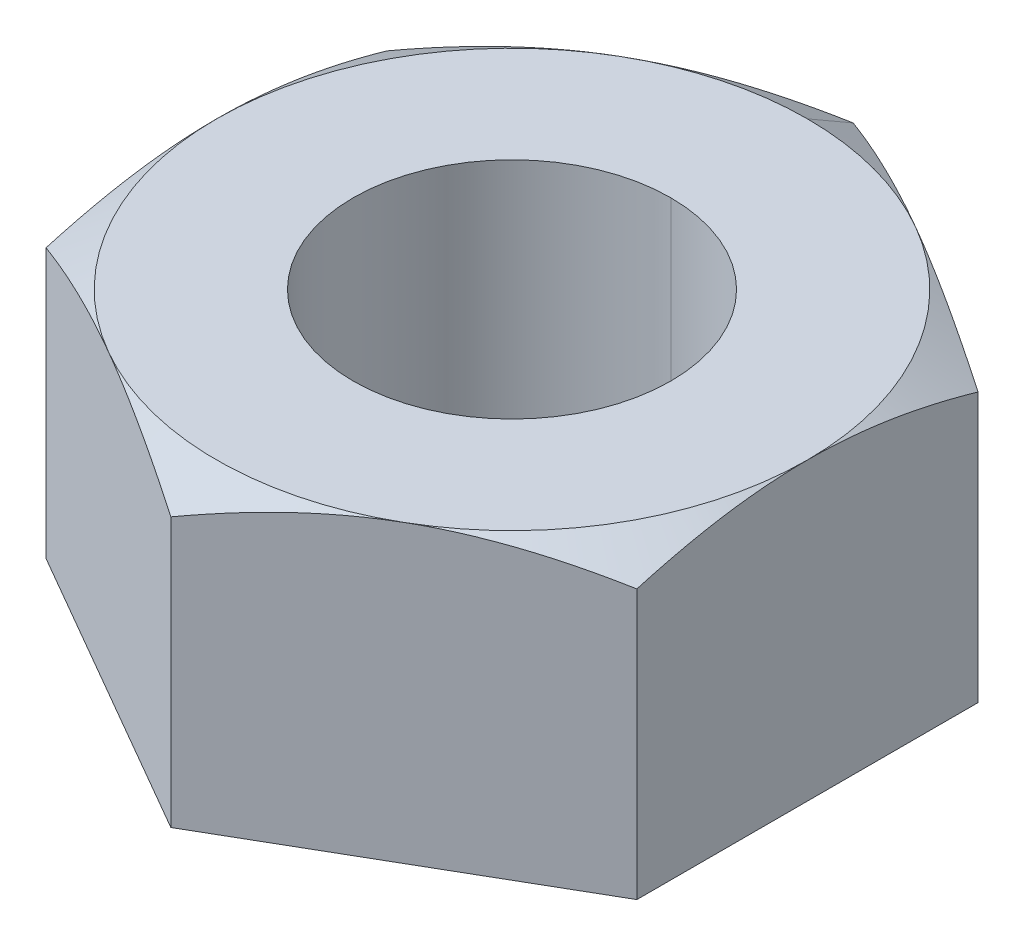
ISO-10303-21;
HEADER;
FILE_DESCRIPTION(('STEP AP214'),'2;1');
FILE_NAME('part.step','',(''),(''),'','','');
FILE_SCHEMA(('AUTOMOTIVE_DESIGN { 1 0 10303 214 1 1 1 1 }'));
ENDSEC;
DATA;
#1=APPLICATION_CONTEXT('core data for automotive mechanical design processes');
#2=APPLICATION_PROTOCOL_DEFINITION('international standard','automotive_design',2000,#1);
#3=PRODUCT_CONTEXT('',#1,'mechanical');
#4=PRODUCT('Part','Part','',(#3));
#5=PRODUCT_RELATED_PRODUCT_CATEGORY('part','',(#4));
#6=PRODUCT_DEFINITION_FORMATION('','',#4);
#7=PRODUCT_DEFINITION_CONTEXT('part definition',#1,'design');
#8=PRODUCT_DEFINITION('design','',#6,#7);
#9=PRODUCT_DEFINITION_SHAPE('','',#8);
#10=(LENGTH_UNIT() NAMED_UNIT(*) SI_UNIT(.MILLI.,.METRE.));
#11=(NAMED_UNIT(*) PLANE_ANGLE_UNIT() SI_UNIT($,.RADIAN.));
#12=(NAMED_UNIT(*) SI_UNIT($,.STERADIAN.) SOLID_ANGLE_UNIT());
#13=UNCERTAINTY_MEASURE_WITH_UNIT(LENGTH_MEASURE(1.E-05),#10,'distance_accuracy_value','');
#14=(GEOMETRIC_REPRESENTATION_CONTEXT(3) GLOBAL_UNCERTAINTY_ASSIGNED_CONTEXT((#13)) GLOBAL_UNIT_ASSIGNED_CONTEXT((#10,
#11,#12)) REPRESENTATION_CONTEXT('',''));
#15=CARTESIAN_POINT('',(0.,0.,0.));
#16=DIRECTION('',(0.,0.,1.));
#17=DIRECTION('',(1.,0.,0.));
#18=AXIS2_PLACEMENT_3D('',#15,#16,#17);
#19=CARTESIAN_POINT('',(0.,4.,0.));
#20=DIRECTION('',(0.,-1.,0.));
#21=DIRECTION('',(0.,0.,-1.));
#22=AXIS2_PLACEMENT_3D('',#19,#20,#21);
#23=CONICAL_SURFACE('',#22,4.,1.0471975511966);
#24=CARTESIAN_POINT('',(-2.,4.,3.46410161513776));
#25=CARTESIAN_POINT('',(-2.49519443537965,4.,3.17820097457012));
#26=CARTESIAN_POINT('',(-3.01152933126461,3.90355711876249,2.88009488343893));
#27=CARTESIAN_POINT('',(-3.48009044106827,3.81603759640316,2.609571000562));
#28=CARTESIAN_POINT('',(-3.99999999999999,3.64273441009185,2.30940107675852));
#29=B_SPLINE_CURVE_WITH_KNOTS('',2,(#24,#25,#26,#27,#28),.UNSPECIFIED.,.F.,.F.,(3,2,3),(0.,0.5,
1.),.UNSPECIFIED.);
#30=CARTESIAN_POINT('',(-2.,4.,3.46410161513776));
#31=VERTEX_POINT('',#30);
#32=CARTESIAN_POINT('',(-4.,3.64273441009184,2.30940107675852));
#33=VERTEX_POINT('',#32);
#34=EDGE_CURVE('E437',#31,#33,#29,.T.);
#35=ORIENTED_EDGE('',*,*,#34,.F.);
#36=CARTESIAN_POINT('',(0.,4.,0.));
#37=DIRECTION('',(0.,-1.,0.));
#38=DIRECTION('',(0.,0.,1.));
#39=AXIS2_PLACEMENT_3D('',#36,#37,#38);
#40=CIRCLE('',#39,4.);
#41=CARTESIAN_POINT('',(-4.,4.,0.));
#42=VERTEX_POINT('',#41);
#43=EDGE_CURVE('E400',#31,#42,#40,.T.);
#44=ORIENTED_EDGE('',*,*,#43,.T.);
#45=CARTESIAN_POINT('',(-4.,3.64273441009185,2.30940107675853));
#46=CARTESIAN_POINT('',(-4.,3.81524432413674,1.7118092048883));
#47=CARTESIAN_POINT('',(-4.,3.90291557833834,1.17197157061067));
#48=CARTESIAN_POINT('',(-4.,4.,0.574172155142945));
#49=CARTESIAN_POINT('',(-4.,4.,0.));
#50=B_SPLINE_CURVE_WITH_KNOTS('',2,(#45,#46,#47,#48,#49),.UNSPECIFIED.,.F.,.F.,(3,2,3),(0.,0.5,
1.),.UNSPECIFIED.);
#51=EDGE_CURVE('E344',#33,#42,#50,.T.);
#52=ORIENTED_EDGE('',*,*,#51,.F.);
#53=EDGE_LOOP('',(#35,#44,#52));
#54=FACE_BOUND('',#53,.T.);
#55=ADVANCED_FACE('F16',(#54),#23,.T.);
#56=CARTESIAN_POINT('',(0.,4.,0.));
#57=DIRECTION('',(0.,-1.,0.));
#58=DIRECTION('',(0.,0.,-1.));
#59=AXIS2_PLACEMENT_3D('',#56,#57,#58);
#60=CONICAL_SURFACE('',#59,4.,1.0471975511966);
#61=CARTESIAN_POINT('',(0.,4.,0.));
#62=DIRECTION('',(0.,-1.,0.));
#63=DIRECTION('',(0.,0.,1.));
#64=AXIS2_PLACEMENT_3D('',#61,#62,#63);
#65=CIRCLE('',#64,4.);
#66=CARTESIAN_POINT('',(-2.,4.,-3.46410161513775));
#67=VERTEX_POINT('',#66);
#68=EDGE_CURVE('E108',#42,#67,#65,.T.);
#69=ORIENTED_EDGE('',*,*,#68,.T.);
#70=CARTESIAN_POINT('',(-4.,3.64273441009185,-2.3094010767585));
#71=CARTESIAN_POINT('',(-2.92820323028001,4.,-2.92820323027291));
#72=CARTESIAN_POINT('',(-2.,4.,-3.46410161513775));
#73=B_SPLINE_CURVE_WITH_KNOTS('',2,(#70,#71,#72),.UNSPECIFIED.,.F.,.F.,(3,3),(0.,1.),.UNSPECIFIED.);
#74=CARTESIAN_POINT('',(-4.,3.64273441009184,-2.30940107675849));
#75=VERTEX_POINT('',#74);
#76=EDGE_CURVE('E172',#75,#67,#73,.T.);
#77=ORIENTED_EDGE('',*,*,#76,.F.);
#78=CARTESIAN_POINT('',(-4.,4.,0.));
#79=CARTESIAN_POINT('',(-4.,4.,-0.56970033230828));
#80=CARTESIAN_POINT('',(-4.,3.9042801551612,-1.16353768418357));
#81=CARTESIAN_POINT('',(-4.,3.81674034365354,-1.70662684126397));
#82=CARTESIAN_POINT('',(-4.,3.64273441009185,-2.30940107675849));
#83=B_SPLINE_CURVE_WITH_KNOTS('',2,(#78,#79,#80,#81,#82),.UNSPECIFIED.,.F.,.F.,(3,2,3),(0.,0.5,
1.),.UNSPECIFIED.);
#84=EDGE_CURVE('E184',#42,#75,#83,.T.);
#85=ORIENTED_EDGE('',*,*,#84,.F.);
#86=EDGE_LOOP('',(#69,#77,#85));
#87=FACE_BOUND('',#86,.T.);
#88=ADVANCED_FACE('F309',(#87),#60,.T.);
#89=CARTESIAN_POINT('',(0.,4.,0.));
#90=DIRECTION('',(0.,-1.,0.));
#91=DIRECTION('',(0.,0.,-1.));
#92=AXIS2_PLACEMENT_3D('',#89,#90,#91);
#93=CONICAL_SURFACE('',#92,4.,1.0471975511966);
#94=DIRECTION('',(0.,-0.499999999999994,-0.866025403784442));
#95=VECTOR('',#94,1.);
#96=CARTESIAN_POINT('',(0.,4.,-4.));
#97=LINE('',#96,#95);
#98=CARTESIAN_POINT('',(0.,4.,-4.));
#99=VERTEX_POINT('',#98);
#100=CARTESIAN_POINT('',(0.,3.64273441009184,-4.618802153517));
#101=VERTEX_POINT('',#100);
#102=EDGE_CURVE('E303',#99,#101,#97,.T.);
#103=ORIENTED_EDGE('',*,*,#102,.F.);
#104=CARTESIAN_POINT('',(0.,4.,0.));
#105=DIRECTION('',(0.,-1.,0.));
#106=DIRECTION('',(0.,0.,1.));
#107=AXIS2_PLACEMENT_3D('',#104,#105,#106);
#108=CIRCLE('',#107,4.);
#109=CARTESIAN_POINT('',(2.,4.,-3.46410161513775));
#110=VERTEX_POINT('',#109);
#111=EDGE_CURVE('E119',#99,#110,#108,.T.);
#112=ORIENTED_EDGE('',*,*,#111,.T.);
#113=CARTESIAN_POINT('',(0.,3.64273441009185,-4.618802153517));
#114=CARTESIAN_POINT('',(1.07179676971999,4.,-4.00000000000259));
#115=CARTESIAN_POINT('',(2.,4.,-3.46410161513775));
#116=B_SPLINE_CURVE_WITH_KNOTS('',2,(#113,#114,#115),.UNSPECIFIED.,.F.,.F.,(3,3),(0.,1.),.UNSPECIFIED.);
#117=EDGE_CURVE('E264',#101,#110,#116,.T.);
#118=ORIENTED_EDGE('',*,*,#117,.F.);
#119=EDGE_LOOP('',(#103,#112,#118));
#120=FACE_BOUND('',#119,.T.);
#121=ADVANCED_FACE('F238',(#120),#93,.T.);
#122=CARTESIAN_POINT('',(0.,4.,0.));
#123=DIRECTION('',(0.,-1.,0.));
#124=DIRECTION('',(0.,0.,-1.));
#125=AXIS2_PLACEMENT_3D('',#122,#123,#124);
#126=CONICAL_SURFACE('',#125,4.,1.0471975511966);
#127=CARTESIAN_POINT('',(0.,4.,0.));
#128=DIRECTION('',(0.,-1.,0.));
#129=DIRECTION('',(0.,0.,-1.));
#130=AXIS2_PLACEMENT_3D('',#127,#128,#129);
#131=CIRCLE('',#130,4.);
#132=CARTESIAN_POINT('',(4.,4.,0.));
#133=VERTEX_POINT('',#132);
#134=EDGE_CURVE('E45',#110,#133,#131,.T.);
#135=ORIENTED_EDGE('',*,*,#134,.T.);
#136=CARTESIAN_POINT('',(4.,3.64273441009185,-2.30940107675849));
#137=CARTESIAN_POINT('',(4.,3.81656890594297,-1.70722071891405));
#138=CARTESIAN_POINT('',(4.,3.9042801551612,-1.16353768418357));
#139=CARTESIAN_POINT('',(4.,4.,-0.570212926074025));
#140=CARTESIAN_POINT('',(4.,4.,0.));
#141=B_SPLINE_CURVE_WITH_KNOTS('',2,(#136,#137,#138,#139,#140),.UNSPECIFIED.,.F.,.F.,(3,2,3),
(0.,0.5,1.),.UNSPECIFIED.);
#142=CARTESIAN_POINT('',(4.,3.64273441009184,-2.30940107675849));
#143=VERTEX_POINT('',#142);
#144=EDGE_CURVE('E220',#143,#133,#141,.T.);
#145=ORIENTED_EDGE('',*,*,#144,.F.);
#146=CARTESIAN_POINT('',(2.,4.,-3.46410161513775));
#147=CARTESIAN_POINT('',(2.49519443537732,4.,-3.17820097457144));
#148=CARTESIAN_POINT('',(3.01152933126462,3.9035571187625,-2.88009488343892));
#149=CARTESIAN_POINT('',(3.48009044106552,3.81603759640408,-2.60957100056358));
#150=CARTESIAN_POINT('',(4.,3.64273441009185,-2.30940107675849));
#151=B_SPLINE_CURVE_WITH_KNOTS('',2,(#146,#147,#148,#149,#150),.UNSPECIFIED.,.F.,.F.,(3,2,3),
(0.,0.5,1.),.UNSPECIFIED.);
#152=EDGE_CURVE('E296',#110,#143,#151,.T.);
#153=ORIENTED_EDGE('',*,*,#152,.F.);
#154=EDGE_LOOP('',(#135,#145,#153));
#155=FACE_BOUND('',#154,.T.);
#156=ADVANCED_FACE('F227',(#155),#126,.T.);
#157=CARTESIAN_POINT('',(0.,4.,0.));
#158=DIRECTION('',(0.,-1.,0.));
#159=DIRECTION('',(0.,0.,-1.));
#160=AXIS2_PLACEMENT_3D('',#157,#158,#159);
#161=CONICAL_SURFACE('',#160,4.,1.0471975511966);
#162=CARTESIAN_POINT('',(4.,4.,0.));
#163=CARTESIAN_POINT('',(4.,4.,0.57365965646439));
#164=CARTESIAN_POINT('',(4.,3.90291557833834,1.17197157061066));
#165=CARTESIAN_POINT('',(4.,3.81541581698191,1.71121513624636));
#166=CARTESIAN_POINT('',(4.,3.64273441009184,2.30940107675852));
#167=B_SPLINE_CURVE_WITH_KNOTS('',2,(#162,#163,#164,#165,#166),.UNSPECIFIED.,.F.,.F.,(3,2,3),
(0.,0.5,1.),.UNSPECIFIED.);
#168=CARTESIAN_POINT('',(4.,3.64273441009184,2.30940107675852));
#169=VERTEX_POINT('',#168);
#170=EDGE_CURVE('E190',#133,#169,#167,.T.);
#171=ORIENTED_EDGE('',*,*,#170,.F.);
#172=CARTESIAN_POINT('',(0.,4.,0.));
#173=DIRECTION('',(0.,-1.,0.));
#174=DIRECTION('',(0.,0.,1.));
#175=AXIS2_PLACEMENT_3D('',#172,#173,#174);
#176=CIRCLE('',#175,4.);
#177=CARTESIAN_POINT('',(2.,4.,3.46410161513776));
#178=VERTEX_POINT('',#177);
#179=EDGE_CURVE('E399',#133,#178,#176,.T.);
#180=ORIENTED_EDGE('',*,*,#179,.T.);
#181=CARTESIAN_POINT('',(4.,3.64273441009184,2.3094010767585));
#182=CARTESIAN_POINT('',(2.92820323027999,4.,2.92820323027292));
#183=CARTESIAN_POINT('',(2.,4.,3.46410161513776));
#184=B_SPLINE_CURVE_WITH_KNOTS('',2,(#181,#182,#183),.UNSPECIFIED.,.F.,.F.,(3,3),(0.,1.),.UNSPECIFIED.);
#185=EDGE_CURVE('E413',#169,#178,#184,.T.);
#186=ORIENTED_EDGE('',*,*,#185,.F.);
#187=EDGE_LOOP('',(#171,#180,#186));
#188=FACE_BOUND('',#187,.T.);
#189=ADVANCED_FACE('F237',(#188),#161,.T.);
#190=CARTESIAN_POINT('',(0.,4.,0.));
#191=DIRECTION('',(0.,-1.,0.));
#192=DIRECTION('',(0.,0.,-1.));
#193=AXIS2_PLACEMENT_3D('',#190,#191,#192);
#194=CONICAL_SURFACE('',#193,4.,1.0471975511966);
#195=CARTESIAN_POINT('',(2.,4.,3.46410161513776));
#196=CARTESIAN_POINT('',(1.50480556462292,4.,3.75000225570392));
#197=CARTESIAN_POINT('',(0.988470668735387,3.90355711876249,4.04810834683658));
#198=CARTESIAN_POINT('',(0.519909558934702,3.81603759640415,4.3186322297118));
#199=CARTESIAN_POINT('',(0.,3.64273441009185,4.618802153517));
#200=B_SPLINE_CURVE_WITH_KNOTS('',2,(#195,#196,#197,#198,#199),.UNSPECIFIED.,.F.,.F.,(3,2,3),
(0.,0.5,1.),.UNSPECIFIED.);
#201=CARTESIAN_POINT('',(0.,3.64273441009184,4.618802153517));
#202=VERTEX_POINT('',#201);
#203=EDGE_CURVE('E496',#178,#202,#200,.T.);
#204=ORIENTED_EDGE('',*,*,#203,.F.);
#205=CARTESIAN_POINT('',(0.,4.,0.));
#206=DIRECTION('',(0.,-1.,0.));
#207=DIRECTION('',(0.,0.,1.));
#208=AXIS2_PLACEMENT_3D('',#205,#206,#207);
#209=CIRCLE('',#208,4.);
#210=EDGE_CURVE('E391',#178,#31,#209,.T.);
#211=ORIENTED_EDGE('',*,*,#210,.T.);
#212=CARTESIAN_POINT('',(0.,3.64273441009185,4.61880215351702));
#213=CARTESIAN_POINT('',(-1.07179676972002,4.,4.00000000000259));
#214=CARTESIAN_POINT('',(-2.,4.,3.46410161513776));
#215=B_SPLINE_CURVE_WITH_KNOTS('',2,(#212,#213,#214),.UNSPECIFIED.,.F.,.F.,(3,3),(0.,1.),.UNSPECIFIED.);
#216=EDGE_CURVE('E406',#202,#31,#215,.T.);
#217=ORIENTED_EDGE('',*,*,#216,.F.);
#218=EDGE_LOOP('',(#204,#211,#217));
#219=FACE_BOUND('',#218,.T.);
#220=ADVANCED_FACE('F374',(#219),#194,.T.);
#221=CARTESIAN_POINT('',(0.,0.,0.));
#222=DIRECTION('',(0.,1.,0.));
#223=DIRECTION('',(0.,0.,1.));
#224=AXIS2_PLACEMENT_3D('',#221,#222,#223);
#225=CYLINDRICAL_SURFACE('',#224,2.15);
#226=DIRECTION('',(0.,1.,0.));
#227=VECTOR('',#226,1.);
#228=CARTESIAN_POINT('',(0.,0.,-2.15));
#229=LINE('',#228,#227);
#230=CARTESIAN_POINT('',(0.,0.,-2.15));
#231=VERTEX_POINT('',#230);
#232=CARTESIAN_POINT('',(0.,4.,-2.15));
#233=VERTEX_POINT('',#232);
#234=EDGE_CURVE('E154',#231,#233,#229,.T.);
#235=ORIENTED_EDGE('',*,*,#234,.F.);
#236=CARTESIAN_POINT('',(0.,0.,0.));
#237=DIRECTION('',(0.,1.,0.));
#238=DIRECTION('',(0.,0.,1.));
#239=AXIS2_PLACEMENT_3D('',#236,#237,#238);
#240=CIRCLE('',#239,2.15);
#241=CARTESIAN_POINT('',(0.,0.,2.15));
#242=VERTEX_POINT('',#241);
#243=EDGE_CURVE('E10',#242,#231,#240,.T.);
#244=ORIENTED_EDGE('',*,*,#243,.F.);
#245=DIRECTION('',(0.,1.,0.));
#246=VECTOR('',#245,1.);
#247=CARTESIAN_POINT('',(0.,0.,2.15));
#248=LINE('',#247,#246);
#249=CARTESIAN_POINT('',(0.,4.,2.15));
#250=VERTEX_POINT('',#249);
#251=EDGE_CURVE('E145',#242,#250,#248,.T.);
#252=ORIENTED_EDGE('',*,*,#251,.T.);
#253=CARTESIAN_POINT('',(0.,4.,0.));
#254=DIRECTION('',(0.,1.,0.));
#255=DIRECTION('',(0.,0.,1.));
#256=AXIS2_PLACEMENT_3D('',#253,#254,#255);
#257=CIRCLE('',#256,2.15);
#258=EDGE_CURVE('E30',#250,#233,#257,.T.);
#259=ORIENTED_EDGE('',*,*,#258,.T.);
#260=EDGE_LOOP('',(#235,#244,#252,#259));
#261=FACE_BOUND('',#260,.T.);
#262=ADVANCED_FACE('F146',(#261),#225,.F.);
#263=CARTESIAN_POINT('',(0.,0.,0.));
#264=DIRECTION('',(0.,1.,0.));
#265=DIRECTION('',(1.,0.,0.));
#266=AXIS2_PLACEMENT_3D('',#263,#264,#265);
#267=PLANE('',#266);
#268=ORIENTED_EDGE('',*,*,#243,.T.);
#269=CARTESIAN_POINT('',(0.,0.,0.));
#270=DIRECTION('',(0.,1.,0.));
#271=DIRECTION('',(0.,0.,1.));
#272=AXIS2_PLACEMENT_3D('',#269,#270,#271);
#273=CIRCLE('',#272,2.15);
#274=EDGE_CURVE('E162',#231,#242,#273,.T.);
#275=ORIENTED_EDGE('',*,*,#274,.T.);
#276=EDGE_LOOP('',(#268,#275));
#277=FACE_BOUND('',#276,.T.);
#278=DIRECTION('',(-0.866025403784439,0.,-0.5));
#279=VECTOR('',#278,1.);
#280=CARTESIAN_POINT('',(4.,0.,-2.30940107675849));
#281=LINE('',#280,#279);
#282=CARTESIAN_POINT('',(4.,0.,-2.30940107675849));
#283=VERTEX_POINT('',#282);
#284=CARTESIAN_POINT('',(0.,0.,-4.618802153517));
#285=VERTEX_POINT('',#284);
#286=EDGE_CURVE('E173',#283,#285,#281,.T.);
#287=ORIENTED_EDGE('',*,*,#286,.F.);
#288=DIRECTION('',(0.,0.,-1.));
#289=VECTOR('',#288,1.);
#290=CARTESIAN_POINT('',(4.,0.,2.30940107675852));
#291=LINE('',#290,#289);
#292=CARTESIAN_POINT('',(4.,0.,2.30940107675852));
#293=VERTEX_POINT('',#292);
#294=EDGE_CURVE('E458',#293,#283,#291,.T.);
#295=ORIENTED_EDGE('',*,*,#294,.F.);
#296=DIRECTION('',(0.866025403784439,0.,-0.5));
#297=VECTOR('',#296,1.);
#298=CARTESIAN_POINT('',(0.,0.,4.61880215351701));
#299=LINE('',#298,#297);
#300=CARTESIAN_POINT('',(0.,0.,4.61880215351701));
#301=VERTEX_POINT('',#300);
#302=EDGE_CURVE('E493',#301,#293,#299,.T.);
#303=ORIENTED_EDGE('',*,*,#302,.F.);
#304=DIRECTION('',(0.866025403784439,0.,0.5));
#305=VECTOR('',#304,1.);
#306=CARTESIAN_POINT('',(-4.,0.,2.30940107675851));
#307=LINE('',#306,#305);
#308=CARTESIAN_POINT('',(-4.,0.,2.30940107675851));
#309=VERTEX_POINT('',#308);
#310=EDGE_CURVE('E480',#309,#301,#307,.T.);
#311=ORIENTED_EDGE('',*,*,#310,.F.);
#312=DIRECTION('',(0.,0.,1.));
#313=VECTOR('',#312,1.);
#314=CARTESIAN_POINT('',(-4.,0.,-2.30940107675849));
#315=LINE('',#314,#313);
#316=CARTESIAN_POINT('',(-4.,0.,-2.30940107675849));
#317=VERTEX_POINT('',#316);
#318=EDGE_CURVE('E179',#317,#309,#315,.T.);
#319=ORIENTED_EDGE('',*,*,#318,.F.);
#320=DIRECTION('',(-0.866025403784439,0.,0.5));
#321=VECTOR('',#320,1.);
#322=CARTESIAN_POINT('',(0.,0.,-4.618802153517));
#323=LINE('',#322,#321);
#324=EDGE_CURVE('E167',#285,#317,#323,.T.);
#325=ORIENTED_EDGE('',*,*,#324,.F.);
#326=EDGE_LOOP('',(#287,#295,#303,#311,#319,#325));
#327=FACE_BOUND('',#326,.T.);
#328=ADVANCED_FACE('F205',(#277,#327),#267,.F.);
#329=CARTESIAN_POINT('',(0.,4.,0.));
#330=DIRECTION('',(0.,1.,0.));
#331=DIRECTION('',(1.,0.,0.));
#332=AXIS2_PLACEMENT_3D('',#329,#330,#331);
#333=PLANE('',#332);
#334=ORIENTED_EDGE('',*,*,#258,.F.);
#335=CARTESIAN_POINT('',(0.,4.,0.));
#336=DIRECTION('',(0.,1.,0.));
#337=DIRECTION('',(0.,0.,1.));
#338=AXIS2_PLACEMENT_3D('',#335,#336,#337);
#339=CIRCLE('',#338,2.15);
#340=EDGE_CURVE('E137',#233,#250,#339,.T.);
#341=ORIENTED_EDGE('',*,*,#340,.F.);
#342=EDGE_LOOP('',(#334,#341));
#343=FACE_BOUND('',#342,.T.);
#344=ORIENTED_EDGE('',*,*,#43,.F.);
#345=ORIENTED_EDGE('',*,*,#210,.F.);
#346=ORIENTED_EDGE('',*,*,#179,.F.);
#347=ORIENTED_EDGE('',*,*,#134,.F.);
#348=ORIENTED_EDGE('',*,*,#111,.F.);
#349=CARTESIAN_POINT('',(0.,4.,0.));
#350=DIRECTION('',(0.,-1.,0.));
#351=DIRECTION('',(0.,0.,1.));
#352=AXIS2_PLACEMENT_3D('',#349,#350,#351);
#353=CIRCLE('',#352,4.);
#354=EDGE_CURVE('E299',#67,#99,#353,.T.);
#355=ORIENTED_EDGE('',*,*,#354,.F.);
#356=ORIENTED_EDGE('',*,*,#68,.F.);
#357=EDGE_LOOP('',(#344,#345,#346,#347,#348,#355,#356));
#358=FACE_BOUND('',#357,.T.);
#359=ADVANCED_FACE('F135',(#343,#358),#333,.T.);
#360=CARTESIAN_POINT('',(4.,4.,2.30940107675852));
#361=DIRECTION('',(-1.,0.,0.));
#362=DIRECTION('',(0.,1.,0.));
#363=AXIS2_PLACEMENT_3D('',#360,#361,#362);
#364=PLANE('',#363);
#365=DIRECTION('',(0.,-1.,0.));
#366=VECTOR('',#365,1.);
#367=CARTESIAN_POINT('',(4.,4.,-2.30940107675849));
#368=LINE('',#367,#366);
#369=EDGE_CURVE('E177',#143,#283,#368,.T.);
#370=ORIENTED_EDGE('',*,*,#369,.F.);
#371=ORIENTED_EDGE('',*,*,#144,.T.);
#372=ORIENTED_EDGE('',*,*,#170,.T.);
#373=DIRECTION('',(0.,-1.,0.));
#374=VECTOR('',#373,1.);
#375=CARTESIAN_POINT('',(4.,4.,2.30940107675852));
#376=LINE('',#375,#374);
#377=EDGE_CURVE('E485',#169,#293,#376,.T.);
#378=ORIENTED_EDGE('',*,*,#377,.T.);
#379=ORIENTED_EDGE('',*,*,#294,.T.);
#380=EDGE_LOOP('',(#370,#371,#372,#378,#379));
#381=FACE_BOUND('',#380,.T.);
#382=ADVANCED_FACE('F196',(#381),#364,.F.);
#383=CARTESIAN_POINT('',(0.,4.,4.61880215351701));
#384=DIRECTION('',(-0.5,0.,-0.866025403784439));
#385=DIRECTION('',(-0.866025403784439,0.,0.5));
#386=AXIS2_PLACEMENT_3D('',#383,#384,#385);
#387=PLANE('',#386);
#388=ORIENTED_EDGE('',*,*,#377,.F.);
#389=ORIENTED_EDGE('',*,*,#185,.T.);
#390=ORIENTED_EDGE('',*,*,#203,.T.);
#391=DIRECTION('',(0.,-1.,0.));
#392=VECTOR('',#391,1.);
#393=CARTESIAN_POINT('',(0.,4.,4.61880215351701));
#394=LINE('',#393,#392);
#395=EDGE_CURVE('E183',#202,#301,#394,.T.);
#396=ORIENTED_EDGE('',*,*,#395,.T.);
#397=ORIENTED_EDGE('',*,*,#302,.T.);
#398=EDGE_LOOP('',(#388,#389,#390,#396,#397));
#399=FACE_BOUND('',#398,.T.);
#400=ADVANCED_FACE('F18',(#399),#387,.F.);
#401=CARTESIAN_POINT('',(-4.,4.,2.30940107675851));
#402=DIRECTION('',(0.5,0.,-0.866025403784439));
#403=DIRECTION('',(0.,-1.,0.));
#404=AXIS2_PLACEMENT_3D('',#401,#402,#403);
#405=PLANE('',#404);
#406=ORIENTED_EDGE('',*,*,#395,.F.);
#407=ORIENTED_EDGE('',*,*,#216,.T.);
#408=ORIENTED_EDGE('',*,*,#34,.T.);
#409=DIRECTION('',(0.,-1.,0.));
#410=VECTOR('',#409,1.);
#411=CARTESIAN_POINT('',(-4.,4.,2.30940107675851));
#412=LINE('',#411,#410);
#413=EDGE_CURVE('E171',#33,#309,#412,.T.);
#414=ORIENTED_EDGE('',*,*,#413,.T.);
#415=ORIENTED_EDGE('',*,*,#310,.T.);
#416=EDGE_LOOP('',(#406,#407,#408,#414,#415));
#417=FACE_BOUND('',#416,.T.);
#418=ADVANCED_FACE('F281',(#417),#405,.F.);
#419=CARTESIAN_POINT('',(-4.,4.,-2.30940107675849));
#420=DIRECTION('',(1.,0.,0.));
#421=DIRECTION('',(0.,1.,0.));
#422=AXIS2_PLACEMENT_3D('',#419,#420,#421);
#423=PLANE('',#422);
#424=ORIENTED_EDGE('',*,*,#413,.F.);
#425=ORIENTED_EDGE('',*,*,#51,.T.);
#426=ORIENTED_EDGE('',*,*,#84,.T.);
#427=DIRECTION('',(0.,-1.,0.));
#428=VECTOR('',#427,1.);
#429=CARTESIAN_POINT('',(-4.,4.,-2.30940107675849));
#430=LINE('',#429,#428);
#431=EDGE_CURVE('E176',#75,#317,#430,.T.);
#432=ORIENTED_EDGE('',*,*,#431,.T.);
#433=ORIENTED_EDGE('',*,*,#318,.T.);
#434=EDGE_LOOP('',(#424,#425,#426,#432,#433));
#435=FACE_BOUND('',#434,.T.);
#436=ADVANCED_FACE('F349',(#435),#423,.F.);
#437=CARTESIAN_POINT('',(0.,4.,-4.618802153517));
#438=DIRECTION('',(0.5,0.,0.866025403784439));
#439=DIRECTION('',(0.,-1.,0.));
#440=AXIS2_PLACEMENT_3D('',#437,#438,#439);
#441=PLANE('',#440);
#442=ORIENTED_EDGE('',*,*,#431,.F.);
#443=ORIENTED_EDGE('',*,*,#76,.T.);
#444=CARTESIAN_POINT('',(-2.,4.,-3.46410161513775));
#445=CARTESIAN_POINT('',(-1.5048055646216,4.,-3.75000225570467));
#446=CARTESIAN_POINT('',(-0.988470668735378,3.9035571187625,-4.04810834683658));
#447=CARTESIAN_POINT('',(-0.519909558933215,3.81603759640366,-4.31863222971265));
#448=CARTESIAN_POINT('',(0.,3.64273441009185,-4.618802153517));
#449=B_SPLINE_CURVE_WITH_KNOTS('',2,(#444,#445,#446,#447,#448),.UNSPECIFIED.,.F.,.F.,(3,2,3),
(0.,0.5,1.),.UNSPECIFIED.);
#450=EDGE_CURVE('E878',#67,#101,#449,.T.);
#451=ORIENTED_EDGE('',*,*,#450,.T.);
#452=DIRECTION('',(0.,-1.,0.));
#453=VECTOR('',#452,1.);
#454=CARTESIAN_POINT('',(0.,4.,-4.618802153517));
#455=LINE('',#454,#453);
#456=EDGE_CURVE('E151',#101,#285,#455,.T.);
#457=ORIENTED_EDGE('',*,*,#456,.T.);
#458=ORIENTED_EDGE('',*,*,#324,.T.);
#459=EDGE_LOOP('',(#442,#443,#451,#457,#458));
#460=FACE_BOUND('',#459,.T.);
#461=ADVANCED_FACE('F280',(#460),#441,.F.);
#462=CARTESIAN_POINT('',(4.,4.,-2.30940107675849));
#463=DIRECTION('',(-0.5,0.,0.866025403784439));
#464=DIRECTION('',(0.,1.,0.));
#465=AXIS2_PLACEMENT_3D('',#462,#463,#464);
#466=PLANE('',#465);
#467=ORIENTED_EDGE('',*,*,#456,.F.);
#468=ORIENTED_EDGE('',*,*,#117,.T.);
#469=ORIENTED_EDGE('',*,*,#152,.T.);
#470=ORIENTED_EDGE('',*,*,#369,.T.);
#471=ORIENTED_EDGE('',*,*,#286,.T.);
#472=EDGE_LOOP('',(#467,#468,#469,#470,#471));
#473=FACE_BOUND('',#472,.T.);
#474=ADVANCED_FACE('F270',(#473),#466,.F.);
#475=CARTESIAN_POINT('',(0.,0.,0.));
#476=DIRECTION('',(0.,1.,0.));
#477=DIRECTION('',(0.,0.,1.));
#478=AXIS2_PLACEMENT_3D('',#475,#476,#477);
#479=CYLINDRICAL_SURFACE('',#478,2.15);
#480=ORIENTED_EDGE('',*,*,#274,.F.);
#481=ORIENTED_EDGE('',*,*,#234,.T.);
#482=ORIENTED_EDGE('',*,*,#340,.T.);
#483=ORIENTED_EDGE('',*,*,#251,.F.);
#484=EDGE_LOOP('',(#480,#481,#482,#483));
#485=FACE_BOUND('',#484,.T.);
#486=ADVANCED_FACE('F153',(#485),#479,.F.);
#487=CARTESIAN_POINT('',(0.,4.,0.));
#488=DIRECTION('',(0.,-1.,0.));
#489=DIRECTION('',(0.,0.,-1.));
#490=AXIS2_PLACEMENT_3D('',#487,#488,#489);
#491=CONICAL_SURFACE('',#490,4.,1.0471975511966);
#492=ORIENTED_EDGE('',*,*,#354,.T.);
#493=ORIENTED_EDGE('',*,*,#102,.T.);
#494=ORIENTED_EDGE('',*,*,#450,.F.);
#495=EDGE_LOOP('',(#492,#493,#494));
#496=FACE_BOUND('',#495,.T.);
#497=ADVANCED_FACE('F619',(#496),#491,.T.);
#498=CLOSED_SHELL('',(#55,#88,#121,#156,#189,#220,#262,#328,#359,#382,#400,#418,#436,#461,#474,
#486,#497));
#499=MANIFOLD_SOLID_BREP('B1',#498);
#500=ADVANCED_BREP_SHAPE_REPRESENTATION('',(#18,#499),#14);
#501=SHAPE_DEFINITION_REPRESENTATION(#9,#500);
ENDSEC;
END-ISO-10303-21;
